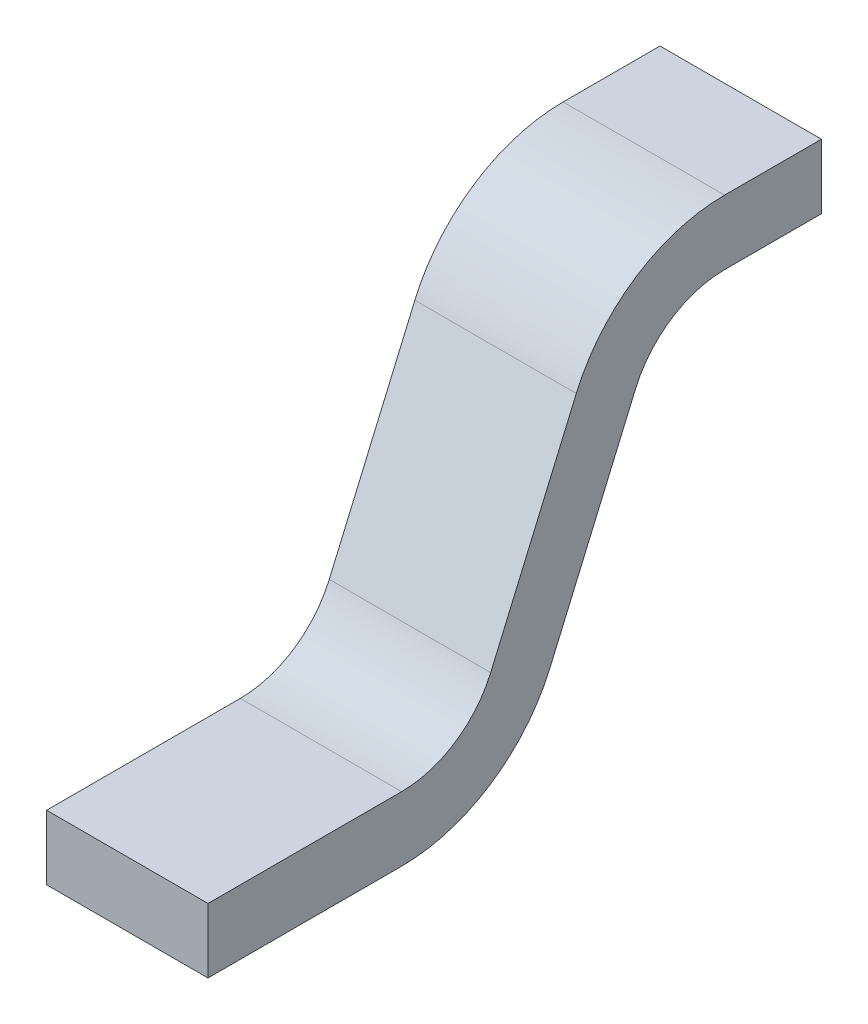
ISO-10303-21;
HEADER;
FILE_DESCRIPTION(('STEP AP214'),'2;1');
FILE_NAME('part.step','',(''),(''),'','','');
FILE_SCHEMA(('AUTOMOTIVE_DESIGN { 1 0 10303 214 1 1 1 1 }'));
ENDSEC;
DATA;
#1=APPLICATION_CONTEXT('core data for automotive mechanical design processes');
#2=APPLICATION_PROTOCOL_DEFINITION('international standard','automotive_design',2000,#1);
#3=PRODUCT_CONTEXT('',#1,'mechanical');
#4=PRODUCT('Part','Part','',(#3));
#5=PRODUCT_RELATED_PRODUCT_CATEGORY('part','',(#4));
#6=PRODUCT_DEFINITION_FORMATION('','',#4);
#7=PRODUCT_DEFINITION_CONTEXT('part definition',#1,'design');
#8=PRODUCT_DEFINITION('design','',#6,#7);
#9=PRODUCT_DEFINITION_SHAPE('','',#8);
#10=(LENGTH_UNIT() NAMED_UNIT(*) SI_UNIT(.MILLI.,.METRE.));
#11=(NAMED_UNIT(*) PLANE_ANGLE_UNIT() SI_UNIT($,.RADIAN.));
#12=(NAMED_UNIT(*) SI_UNIT($,.STERADIAN.) SOLID_ANGLE_UNIT());
#13=UNCERTAINTY_MEASURE_WITH_UNIT(LENGTH_MEASURE(1.E-05),#10,'distance_accuracy_value','');
#14=(GEOMETRIC_REPRESENTATION_CONTEXT(3) GLOBAL_UNCERTAINTY_ASSIGNED_CONTEXT((#13)) GLOBAL_UNIT_ASSIGNED_CONTEXT((#10,
#11,#12)) REPRESENTATION_CONTEXT('',''));
#15=CARTESIAN_POINT('',(0.,0.,0.));
#16=DIRECTION('',(0.,0.,1.));
#17=DIRECTION('',(1.,0.,0.));
#18=AXIS2_PLACEMENT_3D('',#15,#16,#17);
#19=CARTESIAN_POINT('',(-0.125,-0.2,0.15));
#20=DIRECTION('',(1.,0.,0.));
#21=DIRECTION('',(0.,1.,0.));
#22=AXIS2_PLACEMENT_3D('',#19,#20,#21);
#23=PLANE('',#22);
#24=CARTESIAN_POINT('',(-0.125,-0.2,0.15));
#25=DIRECTION('',(-1.,0.,0.));
#26=DIRECTION('',(0.,0.,-1.));
#27=AXIS2_PLACEMENT_3D('',#24,#25,#26);
#28=CIRCLE('',#27,0.15);
#29=CARTESIAN_POINT('',(-0.125,-0.14071278992,0.287786163024));
#30=VERTEX_POINT('',#29);
#31=CARTESIAN_POINT('',(-0.125,-0.05,0.15));
#32=VERTEX_POINT('',#31);
#33=EDGE_CURVE('E192',#30,#32,#28,.T.);
#34=ORIENTED_EDGE('',*,*,#33,.F.);
#35=DIRECTION('',(0.,0.918574420160525,-0.395248067201796));
#36=VECTOR('',#35,1.);
#37=CARTESIAN_POINT('',(-0.125,-0.4488120168,0.42035639496));
#38=LINE('',#37,#36);
#39=CARTESIAN_POINT('',(-0.125,-0.4488120168,0.42035639496));
#40=VERTEX_POINT('',#39);
#41=EDGE_CURVE('E193',#40,#30,#38,.T.);
#42=ORIENTED_EDGE('',*,*,#41,.F.);
#43=CARTESIAN_POINT('',(-0.125,-0.35,0.65));
#44=DIRECTION('',(1.,0.,0.));
#45=DIRECTION('',(0.,0.,-1.));
#46=AXIS2_PLACEMENT_3D('',#43,#44,#45);
#47=CIRCLE('',#46,0.25);
#48=CARTESIAN_POINT('',(-0.125,-0.6,0.65));
#49=VERTEX_POINT('',#48);
#50=EDGE_CURVE('E162',#49,#40,#47,.T.);
#51=ORIENTED_EDGE('',*,*,#50,.F.);
#52=DIRECTION('',(0.,0.,-1.));
#53=VECTOR('',#52,1.);
#54=CARTESIAN_POINT('',(-0.125,-0.6,0.15));
#55=LINE('',#54,#53);
#56=CARTESIAN_POINT('',(-0.125,-0.6,0.95));
#57=VERTEX_POINT('',#56);
#58=EDGE_CURVE('E163',#57,#49,#55,.T.);
#59=ORIENTED_EDGE('',*,*,#58,.F.);
#60=DIRECTION('',(0.,-1.,0.));
#61=VECTOR('',#60,1.);
#62=CARTESIAN_POINT('',(-0.125,-0.2,0.95));
#63=LINE('',#62,#61);
#64=CARTESIAN_POINT('',(-0.125,-0.5,0.95));
#65=VERTEX_POINT('',#64);
#66=EDGE_CURVE('E184',#65,#57,#63,.T.);
#67=ORIENTED_EDGE('',*,*,#66,.F.);
#68=DIRECTION('',(0.,0.,1.));
#69=VECTOR('',#68,1.);
#70=CARTESIAN_POINT('',(-0.125,-0.5,0.15));
#71=LINE('',#70,#69);
#72=CARTESIAN_POINT('',(-0.125,-0.5,0.65));
#73=VERTEX_POINT('',#72);
#74=EDGE_CURVE('E207',#73,#65,#71,.T.);
#75=ORIENTED_EDGE('',*,*,#74,.F.);
#76=CARTESIAN_POINT('',(-0.125,-0.35,0.65));
#77=DIRECTION('',(-1.,0.,0.));
#78=DIRECTION('',(0.,0.,-1.));
#79=AXIS2_PLACEMENT_3D('',#76,#77,#78);
#80=CIRCLE('',#79,0.15);
#81=CARTESIAN_POINT('',(-0.125,-0.40928721008,0.512213836976));
#82=VERTEX_POINT('',#81);
#83=EDGE_CURVE('E173',#82,#73,#80,.T.);
#84=ORIENTED_EDGE('',*,*,#83,.F.);
#85=DIRECTION('',(0.,-0.918574420160525,0.395248067201796));
#86=VECTOR('',#85,1.);
#87=CARTESIAN_POINT('',(-0.125,-0.1011879832,0.37964360504));
#88=LINE('',#87,#86);
#89=CARTESIAN_POINT('',(-0.125,-0.1011879832,0.37964360504));
#90=VERTEX_POINT('',#89);
#91=EDGE_CURVE('E174',#90,#82,#88,.T.);
#92=ORIENTED_EDGE('',*,*,#91,.F.);
#93=CARTESIAN_POINT('',(-0.125,-0.2,0.15));
#94=DIRECTION('',(1.,0.,0.));
#95=DIRECTION('',(0.,0.,-1.));
#96=AXIS2_PLACEMENT_3D('',#93,#94,#95);
#97=CIRCLE('',#96,0.25);
#98=CARTESIAN_POINT('',(-0.125,0.05,0.15));
#99=VERTEX_POINT('',#98);
#100=EDGE_CURVE('E127',#99,#90,#97,.T.);
#101=ORIENTED_EDGE('',*,*,#100,.F.);
#102=DIRECTION('',(0.,0.,1.));
#103=VECTOR('',#102,1.);
#104=CARTESIAN_POINT('',(-0.125,0.05,0.15));
#105=LINE('',#104,#103);
#106=CARTESIAN_POINT('',(-0.125,0.05,0.));
#107=VERTEX_POINT('',#106);
#108=EDGE_CURVE('E123',#107,#99,#105,.T.);
#109=ORIENTED_EDGE('',*,*,#108,.F.);
#110=DIRECTION('',(0.,1.,0.));
#111=VECTOR('',#110,1.);
#112=CARTESIAN_POINT('',(-0.125,-0.2,0.));
#113=LINE('',#112,#111);
#114=CARTESIAN_POINT('',(-0.125,-0.05,0.));
#115=VERTEX_POINT('',#114);
#116=EDGE_CURVE('E271',#115,#107,#113,.T.);
#117=ORIENTED_EDGE('',*,*,#116,.F.);
#118=DIRECTION('',(0.,0.,-1.));
#119=VECTOR('',#118,1.);
#120=CARTESIAN_POINT('',(-0.125,-0.05,0.15));
#121=LINE('',#120,#119);
#122=EDGE_CURVE('E11',#32,#115,#121,.T.);
#123=ORIENTED_EDGE('',*,*,#122,.F.);
#124=EDGE_LOOP('',(#34,#42,#51,#59,#67,#75,#84,#92,#101,#109,#117,#123));
#125=FACE_BOUND('',#124,.T.);
#126=ADVANCED_FACE('F17',(#125),#23,.F.);
#127=CARTESIAN_POINT('',(-0.125,-0.05,0.15));
#128=DIRECTION('',(0.,-1.,0.));
#129=DIRECTION('',(0.,0.,-1.));
#130=AXIS2_PLACEMENT_3D('',#127,#128,#129);
#131=PLANE('',#130);
#132=DIRECTION('',(-1.,0.,0.));
#133=VECTOR('',#132,1.);
#134=CARTESIAN_POINT('',(-0.125,-0.05,0.15));
#135=LINE('',#134,#133);
#136=CARTESIAN_POINT('',(0.125,-0.05,0.15));
#137=VERTEX_POINT('',#136);
#138=EDGE_CURVE('E28',#137,#32,#135,.T.);
#139=ORIENTED_EDGE('',*,*,#138,.T.);
#140=ORIENTED_EDGE('',*,*,#122,.T.);
#141=DIRECTION('',(1.,0.,0.));
#142=VECTOR('',#141,1.);
#143=CARTESIAN_POINT('',(-0.125,-0.05,0.));
#144=LINE('',#143,#142);
#145=CARTESIAN_POINT('',(0.125,-0.05,0.));
#146=VERTEX_POINT('',#145);
#147=EDGE_CURVE('E179',#115,#146,#144,.T.);
#148=ORIENTED_EDGE('',*,*,#147,.T.);
#149=DIRECTION('',(0.,0.,1.));
#150=VECTOR('',#149,1.);
#151=CARTESIAN_POINT('',(0.125,-0.05,0.15));
#152=LINE('',#151,#150);
#153=EDGE_CURVE('E151',#146,#137,#152,.T.);
#154=ORIENTED_EDGE('',*,*,#153,.T.);
#155=EDGE_LOOP('',(#139,#140,#148,#154));
#156=FACE_BOUND('',#155,.T.);
#157=ADVANCED_FACE('F266',(#156),#131,.T.);
#158=CARTESIAN_POINT('',(-0.125,-0.2,0.15));
#159=DIRECTION('',(1.,0.,0.));
#160=DIRECTION('',(0.,0.,-1.));
#161=AXIS2_PLACEMENT_3D('',#158,#159,#160);
#162=CYLINDRICAL_SURFACE('',#161,0.15);
#163=CARTESIAN_POINT('',(0.125,-0.2,0.15));
#164=DIRECTION('',(-1.,0.,0.));
#165=DIRECTION('',(0.,0.,-1.));
#166=AXIS2_PLACEMENT_3D('',#163,#164,#165);
#167=CIRCLE('',#166,0.15);
#168=CARTESIAN_POINT('',(0.125,-0.14071278992,0.287786163024));
#169=VERTEX_POINT('',#168);
#170=EDGE_CURVE('E168',#169,#137,#167,.T.);
#171=ORIENTED_EDGE('',*,*,#170,.F.);
#172=DIRECTION('',(1.,0.,0.));
#173=VECTOR('',#172,1.);
#174=CARTESIAN_POINT('',(-0.125,-0.14071278992,0.287786163024));
#175=LINE('',#174,#173);
#176=EDGE_CURVE('E189',#30,#169,#175,.T.);
#177=ORIENTED_EDGE('',*,*,#176,.F.);
#178=ORIENTED_EDGE('',*,*,#33,.T.);
#179=ORIENTED_EDGE('',*,*,#138,.F.);
#180=EDGE_LOOP('',(#171,#177,#178,#179));
#181=FACE_BOUND('',#180,.T.);
#182=ADVANCED_FACE('F261',(#181),#162,.F.);
#183=CARTESIAN_POINT('',(-0.125,-0.14071278992,0.287786163024));
#184=DIRECTION('',(0.,-0.395248067201796,-0.918574420160525));
#185=DIRECTION('',(0.,-0.918574420160525,0.395248067201796));
#186=AXIS2_PLACEMENT_3D('',#183,#184,#185);
#187=PLANE('',#186);
#188=DIRECTION('',(-1.,0.,0.));
#189=VECTOR('',#188,1.);
#190=CARTESIAN_POINT('',(-0.125,-0.4488120168,0.42035639496));
#191=LINE('',#190,#189);
#192=CARTESIAN_POINT('',(0.125,-0.4488120168,0.42035639496));
#193=VERTEX_POINT('',#192);
#194=EDGE_CURVE('E188',#193,#40,#191,.T.);
#195=ORIENTED_EDGE('',*,*,#194,.T.);
#196=ORIENTED_EDGE('',*,*,#41,.T.);
#197=ORIENTED_EDGE('',*,*,#176,.T.);
#198=DIRECTION('',(0.,-0.918574420160525,0.395248067201796));
#199=VECTOR('',#198,1.);
#200=CARTESIAN_POINT('',(0.125,-0.14071278992,0.287786163024));
#201=LINE('',#200,#199);
#202=EDGE_CURVE('E164',#169,#193,#201,.T.);
#203=ORIENTED_EDGE('',*,*,#202,.T.);
#204=EDGE_LOOP('',(#195,#196,#197,#203));
#205=FACE_BOUND('',#204,.T.);
#206=ADVANCED_FACE('F286',(#205),#187,.T.);
#207=CARTESIAN_POINT('',(-0.125,-0.35,0.65));
#208=DIRECTION('',(1.,0.,0.));
#209=DIRECTION('',(0.,0.,-1.));
#210=AXIS2_PLACEMENT_3D('',#207,#208,#209);
#211=CYLINDRICAL_SURFACE('',#210,0.25);
#212=DIRECTION('',(-1.,0.,0.));
#213=VECTOR('',#212,1.);
#214=CARTESIAN_POINT('',(-0.125,-0.6,0.65));
#215=LINE('',#214,#213);
#216=CARTESIAN_POINT('',(0.125,-0.6,0.65));
#217=VERTEX_POINT('',#216);
#218=EDGE_CURVE('E158',#217,#49,#215,.T.);
#219=ORIENTED_EDGE('',*,*,#218,.T.);
#220=ORIENTED_EDGE('',*,*,#50,.T.);
#221=ORIENTED_EDGE('',*,*,#194,.F.);
#222=CARTESIAN_POINT('',(0.125,-0.35,0.65));
#223=DIRECTION('',(-1.,0.,0.));
#224=DIRECTION('',(0.,0.,-1.));
#225=AXIS2_PLACEMENT_3D('',#222,#223,#224);
#226=CIRCLE('',#225,0.25);
#227=EDGE_CURVE('E175',#193,#217,#226,.T.);
#228=ORIENTED_EDGE('',*,*,#227,.T.);
#229=EDGE_LOOP('',(#219,#220,#221,#228));
#230=FACE_BOUND('',#229,.T.);
#231=ADVANCED_FACE('F19',(#230),#211,.T.);
#232=CARTESIAN_POINT('',(-0.125,-0.6,0.95));
#233=DIRECTION('',(0.,-1.,0.));
#234=DIRECTION('',(0.,0.,-1.));
#235=AXIS2_PLACEMENT_3D('',#232,#233,#234);
#236=PLANE('',#235);
#237=DIRECTION('',(-1.,0.,0.));
#238=VECTOR('',#237,1.);
#239=CARTESIAN_POINT('',(-0.125,-0.6,0.95));
#240=LINE('',#239,#238);
#241=CARTESIAN_POINT('',(0.125,-0.6,0.95));
#242=VERTEX_POINT('',#241);
#243=EDGE_CURVE('E180',#242,#57,#240,.T.);
#244=ORIENTED_EDGE('',*,*,#243,.T.);
#245=ORIENTED_EDGE('',*,*,#58,.T.);
#246=ORIENTED_EDGE('',*,*,#218,.F.);
#247=DIRECTION('',(0.,0.,1.));
#248=VECTOR('',#247,1.);
#249=CARTESIAN_POINT('',(0.125,-0.6,0.95));
#250=LINE('',#249,#248);
#251=EDGE_CURVE('E21',#217,#242,#250,.T.);
#252=ORIENTED_EDGE('',*,*,#251,.T.);
#253=EDGE_LOOP('',(#244,#245,#246,#252));
#254=FACE_BOUND('',#253,.T.);
#255=ADVANCED_FACE('F309',(#254),#236,.T.);
#256=CARTESIAN_POINT('',(-0.125,-0.6,0.95));
#257=DIRECTION('',(0.,0.,-1.));
#258=DIRECTION('',(0.,-1.,0.));
#259=AXIS2_PLACEMENT_3D('',#256,#257,#258);
#260=PLANE('',#259);
#261=DIRECTION('',(0.,-1.,0.));
#262=VECTOR('',#261,1.);
#263=CARTESIAN_POINT('',(0.125,-0.6,0.95));
#264=LINE('',#263,#262);
#265=CARTESIAN_POINT('',(0.125,-0.5,0.95));
#266=VERTEX_POINT('',#265);
#267=EDGE_CURVE('E239',#266,#242,#264,.T.);
#268=ORIENTED_EDGE('',*,*,#267,.F.);
#269=DIRECTION('',(1.,0.,0.));
#270=VECTOR('',#269,1.);
#271=CARTESIAN_POINT('',(-0.125,-0.5,0.95));
#272=LINE('',#271,#270);
#273=EDGE_CURVE('E204',#65,#266,#272,.T.);
#274=ORIENTED_EDGE('',*,*,#273,.F.);
#275=ORIENTED_EDGE('',*,*,#66,.T.);
#276=ORIENTED_EDGE('',*,*,#243,.F.);
#277=EDGE_LOOP('',(#268,#274,#275,#276));
#278=FACE_BOUND('',#277,.T.);
#279=ADVANCED_FACE('F366',(#278),#260,.F.);
#280=CARTESIAN_POINT('',(-0.125,-0.5,0.95));
#281=DIRECTION('',(0.,-1.,0.));
#282=DIRECTION('',(0.,0.,-1.));
#283=AXIS2_PLACEMENT_3D('',#280,#281,#282);
#284=PLANE('',#283);
#285=DIRECTION('',(0.,0.,1.));
#286=VECTOR('',#285,1.);
#287=CARTESIAN_POINT('',(0.125,-0.5,0.95));
#288=LINE('',#287,#286);
#289=CARTESIAN_POINT('',(0.125,-0.5,0.65));
#290=VERTEX_POINT('',#289);
#291=EDGE_CURVE('E217',#290,#266,#288,.T.);
#292=ORIENTED_EDGE('',*,*,#291,.F.);
#293=DIRECTION('',(1.,0.,0.));
#294=VECTOR('',#293,1.);
#295=CARTESIAN_POINT('',(-0.125,-0.5,0.65));
#296=LINE('',#295,#294);
#297=EDGE_CURVE('E197',#73,#290,#296,.T.);
#298=ORIENTED_EDGE('',*,*,#297,.F.);
#299=ORIENTED_EDGE('',*,*,#74,.T.);
#300=ORIENTED_EDGE('',*,*,#273,.T.);
#301=EDGE_LOOP('',(#292,#298,#299,#300));
#302=FACE_BOUND('',#301,.T.);
#303=ADVANCED_FACE('F234',(#302),#284,.F.);
#304=CARTESIAN_POINT('',(-0.125,-0.35,0.65));
#305=DIRECTION('',(1.,0.,0.));
#306=DIRECTION('',(0.,0.,-1.));
#307=AXIS2_PLACEMENT_3D('',#304,#305,#306);
#308=CYLINDRICAL_SURFACE('',#307,0.15);
#309=CARTESIAN_POINT('',(0.125,-0.35,0.65));
#310=DIRECTION('',(-1.,0.,0.));
#311=DIRECTION('',(0.,0.,-1.));
#312=AXIS2_PLACEMENT_3D('',#309,#310,#311);
#313=CIRCLE('',#312,0.15);
#314=CARTESIAN_POINT('',(0.125,-0.40928721008,0.512213836976));
#315=VERTEX_POINT('',#314);
#316=EDGE_CURVE('E157',#315,#290,#313,.T.);
#317=ORIENTED_EDGE('',*,*,#316,.F.);
#318=DIRECTION('',(1.,0.,0.));
#319=VECTOR('',#318,1.);
#320=CARTESIAN_POINT('',(-0.125,-0.40928721008,0.512213836976));
#321=LINE('',#320,#319);
#322=EDGE_CURVE('E169',#82,#315,#321,.T.);
#323=ORIENTED_EDGE('',*,*,#322,.F.);
#324=ORIENTED_EDGE('',*,*,#83,.T.);
#325=ORIENTED_EDGE('',*,*,#297,.T.);
#326=EDGE_LOOP('',(#317,#323,#324,#325));
#327=FACE_BOUND('',#326,.T.);
#328=ADVANCED_FACE('F230',(#327),#308,.F.);
#329=CARTESIAN_POINT('',(-0.125,-0.1011879832,0.37964360504));
#330=DIRECTION('',(0.,-0.395248067201796,-0.918574420160525));
#331=DIRECTION('',(0.,-0.918574420160525,0.395248067201796));
#332=AXIS2_PLACEMENT_3D('',#329,#330,#331);
#333=PLANE('',#332);
#334=DIRECTION('',(0.,-0.918574420160525,0.395248067201796));
#335=VECTOR('',#334,1.);
#336=CARTESIAN_POINT('',(0.125,-0.1011879832,0.37964360504));
#337=LINE('',#336,#335);
#338=CARTESIAN_POINT('',(0.125,-0.1011879832,0.37964360504));
#339=VERTEX_POINT('',#338);
#340=EDGE_CURVE('E138',#339,#315,#337,.T.);
#341=ORIENTED_EDGE('',*,*,#340,.F.);
#342=DIRECTION('',(1.,0.,0.));
#343=VECTOR('',#342,1.);
#344=CARTESIAN_POINT('',(-0.125,-0.1011879832,0.37964360504));
#345=LINE('',#344,#343);
#346=EDGE_CURVE('E133',#90,#339,#345,.T.);
#347=ORIENTED_EDGE('',*,*,#346,.F.);
#348=ORIENTED_EDGE('',*,*,#91,.T.);
#349=ORIENTED_EDGE('',*,*,#322,.T.);
#350=EDGE_LOOP('',(#341,#347,#348,#349));
#351=FACE_BOUND('',#350,.T.);
#352=ADVANCED_FACE('F243',(#351),#333,.F.);
#353=CARTESIAN_POINT('',(-0.125,-0.2,0.15));
#354=DIRECTION('',(1.,0.,0.));
#355=DIRECTION('',(0.,0.,-1.));
#356=AXIS2_PLACEMENT_3D('',#353,#354,#355);
#357=CYLINDRICAL_SURFACE('',#356,0.25);
#358=DIRECTION('',(-1.,0.,0.));
#359=VECTOR('',#358,1.);
#360=CARTESIAN_POINT('',(-0.125,0.05,0.15));
#361=LINE('',#360,#359);
#362=CARTESIAN_POINT('',(0.125,0.05,0.15));
#363=VERTEX_POINT('',#362);
#364=EDGE_CURVE('E116',#363,#99,#361,.T.);
#365=ORIENTED_EDGE('',*,*,#364,.T.);
#366=ORIENTED_EDGE('',*,*,#100,.T.);
#367=ORIENTED_EDGE('',*,*,#346,.T.);
#368=CARTESIAN_POINT('',(0.125,-0.2,0.15));
#369=DIRECTION('',(-1.,0.,0.));
#370=DIRECTION('',(0.,0.,-1.));
#371=AXIS2_PLACEMENT_3D('',#368,#369,#370);
#372=CIRCLE('',#371,0.25);
#373=EDGE_CURVE('E130',#339,#363,#372,.T.);
#374=ORIENTED_EDGE('',*,*,#373,.T.);
#375=EDGE_LOOP('',(#365,#366,#367,#374));
#376=FACE_BOUND('',#375,.T.);
#377=ADVANCED_FACE('F131',(#376),#357,.T.);
#378=CARTESIAN_POINT('',(-0.125,0.05,0.15));
#379=DIRECTION('',(0.,-1.,0.));
#380=DIRECTION('',(0.,0.,-1.));
#381=AXIS2_PLACEMENT_3D('',#378,#379,#380);
#382=PLANE('',#381);
#383=DIRECTION('',(0.,0.,1.));
#384=VECTOR('',#383,1.);
#385=CARTESIAN_POINT('',(0.125,0.05,0.15));
#386=LINE('',#385,#384);
#387=CARTESIAN_POINT('',(0.125,0.05,0.));
#388=VERTEX_POINT('',#387);
#389=EDGE_CURVE('E121',#388,#363,#386,.T.);
#390=ORIENTED_EDGE('',*,*,#389,.F.);
#391=DIRECTION('',(1.,0.,0.));
#392=VECTOR('',#391,1.);
#393=CARTESIAN_POINT('',(-0.125,0.05,0.));
#394=LINE('',#393,#392);
#395=EDGE_CURVE('E274',#107,#388,#394,.T.);
#396=ORIENTED_EDGE('',*,*,#395,.F.);
#397=ORIENTED_EDGE('',*,*,#108,.T.);
#398=ORIENTED_EDGE('',*,*,#364,.F.);
#399=EDGE_LOOP('',(#390,#396,#397,#398));
#400=FACE_BOUND('',#399,.T.);
#401=ADVANCED_FACE('F118',(#400),#382,.F.);
#402=CARTESIAN_POINT('',(-0.125,0.05,0.));
#403=DIRECTION('',(0.,0.,1.));
#404=DIRECTION('',(1.,0.,0.));
#405=AXIS2_PLACEMENT_3D('',#402,#403,#404);
#406=PLANE('',#405);
#407=DIRECTION('',(0.,1.,0.));
#408=VECTOR('',#407,1.);
#409=CARTESIAN_POINT('',(0.125,0.05,0.));
#410=LINE('',#409,#408);
#411=EDGE_CURVE('E144',#146,#388,#410,.T.);
#412=ORIENTED_EDGE('',*,*,#411,.F.);
#413=ORIENTED_EDGE('',*,*,#147,.F.);
#414=ORIENTED_EDGE('',*,*,#116,.T.);
#415=ORIENTED_EDGE('',*,*,#395,.T.);
#416=EDGE_LOOP('',(#412,#413,#414,#415));
#417=FACE_BOUND('',#416,.T.);
#418=ADVANCED_FACE('F273',(#417),#406,.F.);
#419=CARTESIAN_POINT('',(0.125,-0.2,0.15));
#420=DIRECTION('',(1.,0.,0.));
#421=DIRECTION('',(0.,1.,0.));
#422=AXIS2_PLACEMENT_3D('',#419,#420,#421);
#423=PLANE('',#422);
#424=ORIENTED_EDGE('',*,*,#202,.F.);
#425=ORIENTED_EDGE('',*,*,#170,.T.);
#426=ORIENTED_EDGE('',*,*,#153,.F.);
#427=ORIENTED_EDGE('',*,*,#411,.T.);
#428=ORIENTED_EDGE('',*,*,#389,.T.);
#429=ORIENTED_EDGE('',*,*,#373,.F.);
#430=ORIENTED_EDGE('',*,*,#340,.T.);
#431=ORIENTED_EDGE('',*,*,#316,.T.);
#432=ORIENTED_EDGE('',*,*,#291,.T.);
#433=ORIENTED_EDGE('',*,*,#267,.T.);
#434=ORIENTED_EDGE('',*,*,#251,.F.);
#435=ORIENTED_EDGE('',*,*,#227,.F.);
#436=EDGE_LOOP('',(#424,#425,#426,#427,#428,#429,#430,#431,#432,#433,#434,#435));
#437=FACE_BOUND('',#436,.T.);
#438=ADVANCED_FACE('F141',(#437),#423,.T.);
#439=CLOSED_SHELL('',(#126,#157,#182,#206,#231,#255,#279,#303,#328,#352,#377,#401,#418,#438));
#440=MANIFOLD_SOLID_BREP('B1',#439);
#441=ADVANCED_BREP_SHAPE_REPRESENTATION('',(#18,#440),#14);
#442=SHAPE_DEFINITION_REPRESENTATION(#9,#441);
ENDSEC;
END-ISO-10303-21;
